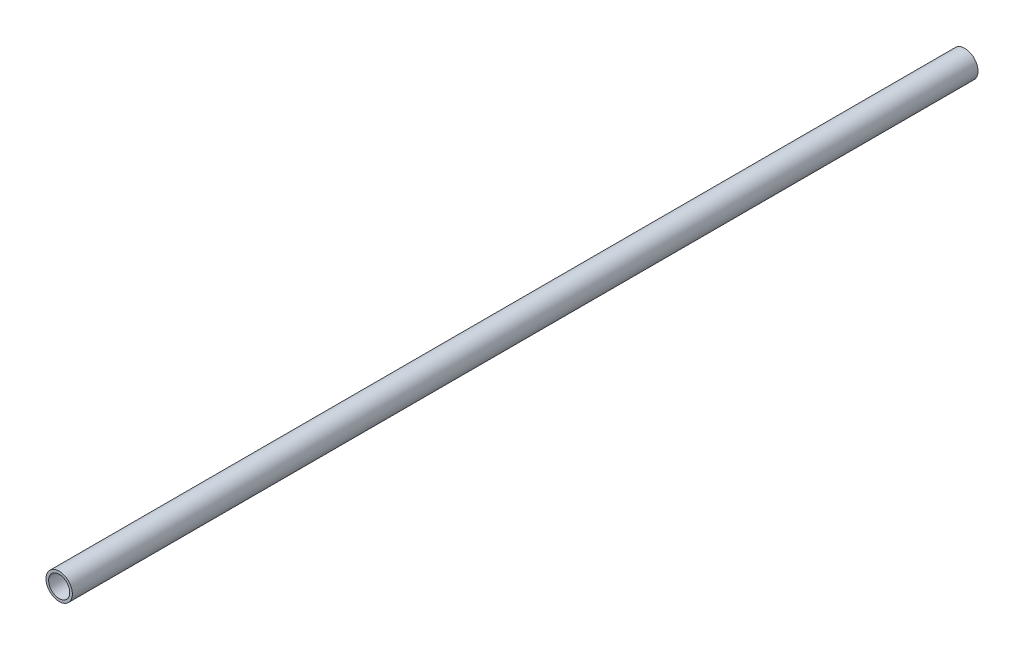
ISO-10303-21;
HEADER;
FILE_DESCRIPTION(('STEP AP214'),'2;1');
FILE_NAME('part.step','',(''),(''),'','','');
FILE_SCHEMA(('AUTOMOTIVE_DESIGN { 1 0 10303 214 1 1 1 1 }'));
ENDSEC;
DATA;
#1=APPLICATION_CONTEXT('core data for automotive mechanical design processes');
#2=APPLICATION_PROTOCOL_DEFINITION('international standard','automotive_design',2000,#1);
#3=PRODUCT_CONTEXT('',#1,'mechanical');
#4=PRODUCT('Part','Part','',(#3));
#5=PRODUCT_RELATED_PRODUCT_CATEGORY('part','',(#4));
#6=PRODUCT_DEFINITION_FORMATION('','',#4);
#7=PRODUCT_DEFINITION_CONTEXT('part definition',#1,'design');
#8=PRODUCT_DEFINITION('design','',#6,#7);
#9=PRODUCT_DEFINITION_SHAPE('','',#8);
#10=(LENGTH_UNIT() NAMED_UNIT(*) SI_UNIT(.MILLI.,.METRE.));
#11=(NAMED_UNIT(*) PLANE_ANGLE_UNIT() SI_UNIT($,.RADIAN.));
#12=(NAMED_UNIT(*) SI_UNIT($,.STERADIAN.) SOLID_ANGLE_UNIT());
#13=UNCERTAINTY_MEASURE_WITH_UNIT(LENGTH_MEASURE(1.E-05),#10,'distance_accuracy_value','');
#14=(GEOMETRIC_REPRESENTATION_CONTEXT(3) GLOBAL_UNCERTAINTY_ASSIGNED_CONTEXT((#13)) GLOBAL_UNIT_ASSIGNED_CONTEXT((#10,
#11,#12)) REPRESENTATION_CONTEXT('',''));
#15=CARTESIAN_POINT('',(0.,0.,0.));
#16=DIRECTION('',(0.,0.,1.));
#17=DIRECTION('',(1.,0.,0.));
#18=AXIS2_PLACEMENT_3D('',#15,#16,#17);
#19=CARTESIAN_POINT('',(0.,0.,343.));
#20=DIRECTION('',(0.,0.,1.));
#21=DIRECTION('',(1.,0.,0.));
#22=AXIS2_PLACEMENT_3D('',#19,#20,#21);
#23=PLANE('',#22);
#24=CARTESIAN_POINT('',(0.,0.,343.));
#25=DIRECTION('',(0.,0.,1.));
#26=DIRECTION('',(1.,0.,0.));
#27=AXIS2_PLACEMENT_3D('',#24,#25,#26);
#28=CIRCLE('',#27,5.);
#29=CARTESIAN_POINT('',(5.,0.,343.));
#30=VERTEX_POINT('',#29);
#31=EDGE_CURVE('E11',#30,#30,#28,.T.);
#32=ORIENTED_EDGE('',*,*,#31,.T.);
#33=EDGE_LOOP('',(#32));
#34=FACE_BOUND('',#33,.T.);
#35=CARTESIAN_POINT('',(0.,0.,343.));
#36=DIRECTION('',(0.,0.,1.));
#37=DIRECTION('',(1.,0.,0.));
#38=AXIS2_PLACEMENT_3D('',#35,#36,#37);
#39=CIRCLE('',#38,4.);
#40=CARTESIAN_POINT('',(4.,0.,343.));
#41=VERTEX_POINT('',#40);
#42=EDGE_CURVE('E58',#41,#41,#39,.T.);
#43=ORIENTED_EDGE('',*,*,#42,.F.);
#44=EDGE_LOOP('',(#43));
#45=FACE_BOUND('',#44,.T.);
#46=ADVANCED_FACE('F47',(#34,#45),#23,.T.);
#47=CARTESIAN_POINT('',(0.,0.,0.));
#48=DIRECTION('',(0.,0.,1.));
#49=DIRECTION('',(1.,0.,0.));
#50=AXIS2_PLACEMENT_3D('',#47,#48,#49);
#51=PLANE('',#50);
#52=CARTESIAN_POINT('',(0.,0.,0.));
#53=DIRECTION('',(0.,0.,1.));
#54=DIRECTION('',(1.,0.,0.));
#55=AXIS2_PLACEMENT_3D('',#52,#53,#54);
#56=CIRCLE('',#55,5.);
#57=CARTESIAN_POINT('',(5.,0.,0.));
#58=VERTEX_POINT('',#57);
#59=EDGE_CURVE('E51',#58,#58,#56,.T.);
#60=ORIENTED_EDGE('',*,*,#59,.F.);
#61=EDGE_LOOP('',(#60));
#62=FACE_BOUND('',#61,.T.);
#63=CARTESIAN_POINT('',(0.,0.,0.));
#64=DIRECTION('',(0.,0.,1.));
#65=DIRECTION('',(1.,0.,0.));
#66=AXIS2_PLACEMENT_3D('',#63,#64,#65);
#67=CIRCLE('',#66,4.);
#68=CARTESIAN_POINT('',(4.,0.,0.));
#69=VERTEX_POINT('',#68);
#70=EDGE_CURVE('E60',#69,#69,#67,.T.);
#71=ORIENTED_EDGE('',*,*,#70,.T.);
#72=EDGE_LOOP('',(#71));
#73=FACE_BOUND('',#72,.T.);
#74=ADVANCED_FACE('F70',(#62,#73),#51,.F.);
#75=CARTESIAN_POINT('',(0.,0.,343.));
#76=DIRECTION('',(0.,0.,-1.));
#77=DIRECTION('',(-1.,0.,0.));
#78=AXIS2_PLACEMENT_3D('',#75,#76,#77);
#79=CYLINDRICAL_SURFACE('',#78,5.);
#80=ORIENTED_EDGE('',*,*,#31,.F.);
#81=EDGE_LOOP('',(#80));
#82=FACE_BOUND('',#81,.T.);
#83=ORIENTED_EDGE('',*,*,#59,.T.);
#84=EDGE_LOOP('',(#83));
#85=FACE_BOUND('',#84,.T.);
#86=ADVANCED_FACE('F49',(#82,#85),#79,.T.);
#87=CARTESIAN_POINT('',(0.,0.,343.));
#88=DIRECTION('',(0.,0.,-1.));
#89=DIRECTION('',(-1.,0.,0.));
#90=AXIS2_PLACEMENT_3D('',#87,#88,#89);
#91=CYLINDRICAL_SURFACE('',#90,4.);
#92=ORIENTED_EDGE('',*,*,#42,.T.);
#93=EDGE_LOOP('',(#92));
#94=FACE_BOUND('',#93,.T.);
#95=ORIENTED_EDGE('',*,*,#70,.F.);
#96=EDGE_LOOP('',(#95));
#97=FACE_BOUND('',#96,.T.);
#98=ADVANCED_FACE('F66',(#94,#97),#91,.F.);
#99=CLOSED_SHELL('',(#46,#74,#86,#98));
#100=MANIFOLD_SOLID_BREP('B2',#99);
#101=ADVANCED_BREP_SHAPE_REPRESENTATION('',(#18,#100),#14);
#102=SHAPE_DEFINITION_REPRESENTATION(#9,#101);
ENDSEC;
END-ISO-10303-21;
